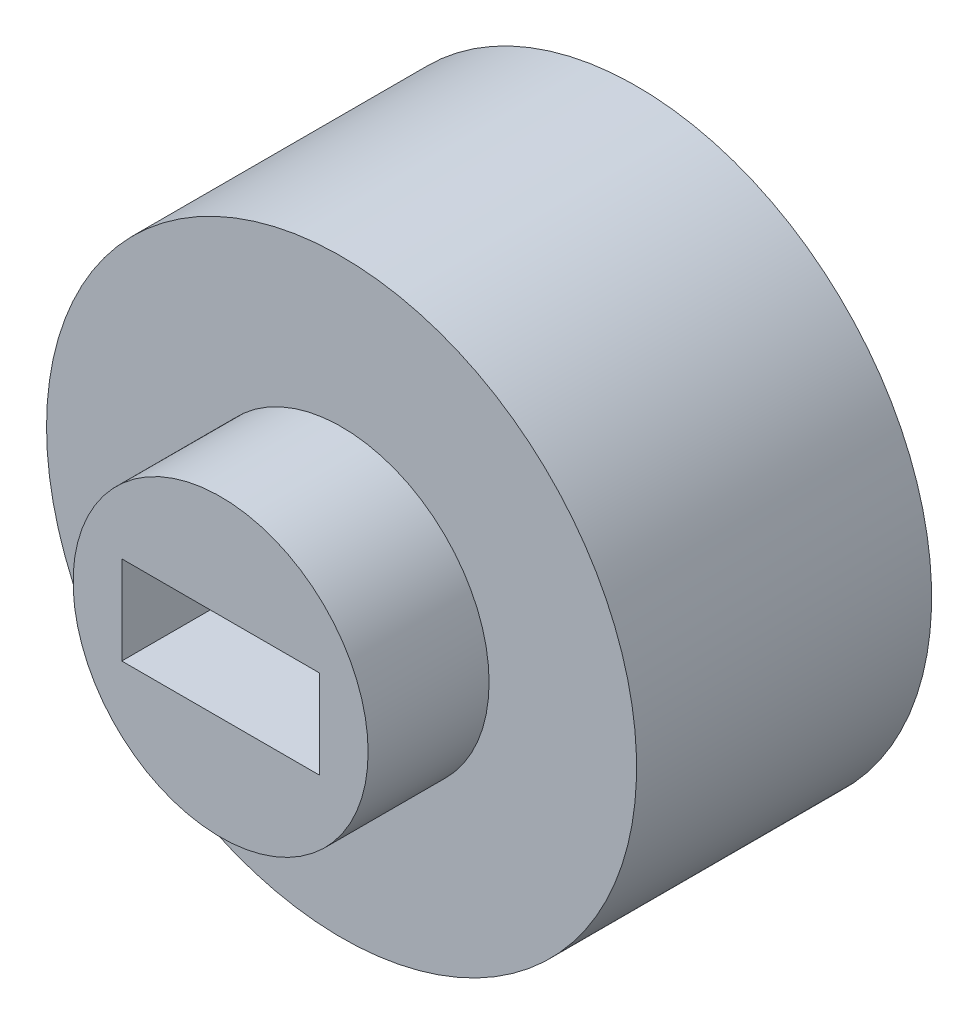
ISO-10303-21;
HEADER;
FILE_DESCRIPTION(('STEP AP214'),'2;1');
FILE_NAME('part.step','',(''),(''),'','','');
FILE_SCHEMA(('AUTOMOTIVE_DESIGN { 1 0 10303 214 1 1 1 1 }'));
ENDSEC;
DATA;
#1=APPLICATION_CONTEXT('core data for automotive mechanical design processes');
#2=APPLICATION_PROTOCOL_DEFINITION('international standard','automotive_design',2000,#1);
#3=PRODUCT_CONTEXT('',#1,'mechanical');
#4=PRODUCT('Part','Part','',(#3));
#5=PRODUCT_RELATED_PRODUCT_CATEGORY('part','',(#4));
#6=PRODUCT_DEFINITION_FORMATION('','',#4);
#7=PRODUCT_DEFINITION_CONTEXT('part definition',#1,'design');
#8=PRODUCT_DEFINITION('design','',#6,#7);
#9=PRODUCT_DEFINITION_SHAPE('','',#8);
#10=(LENGTH_UNIT() NAMED_UNIT(*) SI_UNIT(.MILLI.,.METRE.));
#11=(NAMED_UNIT(*) PLANE_ANGLE_UNIT() SI_UNIT($,.RADIAN.));
#12=(NAMED_UNIT(*) SI_UNIT($,.STERADIAN.) SOLID_ANGLE_UNIT());
#13=UNCERTAINTY_MEASURE_WITH_UNIT(LENGTH_MEASURE(1.E-05),#10,'distance_accuracy_value','');
#14=(GEOMETRIC_REPRESENTATION_CONTEXT(3) GLOBAL_UNCERTAINTY_ASSIGNED_CONTEXT((#13)) GLOBAL_UNIT_ASSIGNED_CONTEXT((#10,
#11,#12)) REPRESENTATION_CONTEXT('',''));
#15=CARTESIAN_POINT('',(0.,0.,0.));
#16=DIRECTION('',(0.,0.,1.));
#17=DIRECTION('',(1.,0.,0.));
#18=AXIS2_PLACEMENT_3D('',#15,#16,#17);
#19=CARTESIAN_POINT('',(0.,0.,41.));
#20=DIRECTION('',(0.,0.,-1.));
#21=DIRECTION('',(-1.,0.,0.));
#22=AXIS2_PLACEMENT_3D('',#19,#20,#21);
#23=CYLINDRICAL_SURFACE('',#22,50.);
#24=CARTESIAN_POINT('',(0.,0.,41.));
#25=DIRECTION('',(0.,0.,1.));
#26=DIRECTION('',(1.,0.,0.));
#27=AXIS2_PLACEMENT_3D('',#24,#25,#26);
#28=CIRCLE('',#27,50.);
#29=CARTESIAN_POINT('',(50.,0.,41.));
#30=VERTEX_POINT('',#29);
#31=EDGE_CURVE('E11',#30,#30,#28,.T.);
#32=ORIENTED_EDGE('',*,*,#31,.F.);
#33=EDGE_LOOP('',(#32));
#34=FACE_BOUND('',#33,.T.);
#35=CARTESIAN_POINT('',(0.,0.,0.));
#36=DIRECTION('',(0.,0.,1.));
#37=DIRECTION('',(1.,0.,0.));
#38=AXIS2_PLACEMENT_3D('',#35,#36,#37);
#39=CIRCLE('',#38,50.);
#40=CARTESIAN_POINT('',(50.,0.,0.));
#41=VERTEX_POINT('',#40);
#42=EDGE_CURVE('E42',#41,#41,#39,.T.);
#43=ORIENTED_EDGE('',*,*,#42,.T.);
#44=EDGE_LOOP('',(#43));
#45=FACE_BOUND('',#44,.T.);
#46=ADVANCED_FACE('F39',(#34,#45),#23,.T.);
#47=CARTESIAN_POINT('',(0.,0.,41.));
#48=DIRECTION('',(0.,0.,1.));
#49=DIRECTION('',(1.,0.,0.));
#50=AXIS2_PLACEMENT_3D('',#47,#48,#49);
#51=PLANE('',#50);
#52=DIRECTION('',(0.,1.,0.));
#53=VECTOR('',#52,1.);
#54=CARTESIAN_POINT('',(33.5,15.,41.));
#55=LINE('',#54,#53);
#56=CARTESIAN_POINT('',(33.5,-15.,41.));
#57=VERTEX_POINT('',#56);
#58=CARTESIAN_POINT('',(33.5,15.,41.));
#59=VERTEX_POINT('',#58);
#60=EDGE_CURVE('E54',#57,#59,#55,.T.);
#61=ORIENTED_EDGE('',*,*,#60,.F.);
#62=DIRECTION('',(1.,0.,0.));
#63=VECTOR('',#62,1.);
#64=CARTESIAN_POINT('',(-33.5,-15.,41.));
#65=LINE('',#64,#63);
#66=CARTESIAN_POINT('',(-33.5,-15.,41.));
#67=VERTEX_POINT('',#66);
#68=EDGE_CURVE('E110',#67,#57,#65,.T.);
#69=ORIENTED_EDGE('',*,*,#68,.F.);
#70=DIRECTION('',(0.,-1.,0.));
#71=VECTOR('',#70,1.);
#72=CARTESIAN_POINT('',(-33.5,15.,41.));
#73=LINE('',#72,#71);
#74=CARTESIAN_POINT('',(-33.5,15.,41.));
#75=VERTEX_POINT('',#74);
#76=EDGE_CURVE('E92',#75,#67,#73,.T.);
#77=ORIENTED_EDGE('',*,*,#76,.F.);
#78=DIRECTION('',(-1.,0.,0.));
#79=VECTOR('',#78,1.);
#80=CARTESIAN_POINT('',(-33.5,15.,41.));
#81=LINE('',#80,#79);
#82=EDGE_CURVE('E106',#59,#75,#81,.T.);
#83=ORIENTED_EDGE('',*,*,#82,.F.);
#84=EDGE_LOOP('',(#61,#69,#77,#83));
#85=FACE_BOUND('',#84,.T.);
#86=ORIENTED_EDGE('',*,*,#31,.T.);
#87=EDGE_LOOP('',(#86));
#88=FACE_BOUND('',#87,.T.);
#89=ADVANCED_FACE('F118',(#85,#88),#51,.T.);
#90=CARTESIAN_POINT('',(33.5,15.,0.));
#91=DIRECTION('',(1.,0.,0.));
#92=DIRECTION('',(0.,0.,-1.));
#93=AXIS2_PLACEMENT_3D('',#90,#91,#92);
#94=PLANE('',#93);
#95=ORIENTED_EDGE('',*,*,#60,.T.);
#96=DIRECTION('',(0.,0.,1.));
#97=VECTOR('',#96,1.);
#98=CARTESIAN_POINT('',(33.5,15.,0.));
#99=LINE('',#98,#97);
#100=CARTESIAN_POINT('',(33.5,15.,0.));
#101=VERTEX_POINT('',#100);
#102=EDGE_CURVE('E88',#101,#59,#99,.T.);
#103=ORIENTED_EDGE('',*,*,#102,.F.);
#104=DIRECTION('',(0.,1.,0.));
#105=VECTOR('',#104,1.);
#106=CARTESIAN_POINT('',(33.5,15.,0.));
#107=LINE('',#106,#105);
#108=CARTESIAN_POINT('',(33.5,-15.,0.));
#109=VERTEX_POINT('',#108);
#110=EDGE_CURVE('E101',#109,#101,#107,.T.);
#111=ORIENTED_EDGE('',*,*,#110,.F.);
#112=DIRECTION('',(0.,0.,1.));
#113=VECTOR('',#112,1.);
#114=CARTESIAN_POINT('',(33.5,-15.,0.));
#115=LINE('',#114,#113);
#116=EDGE_CURVE('E47',#109,#57,#115,.T.);
#117=ORIENTED_EDGE('',*,*,#116,.T.);
#118=EDGE_LOOP('',(#95,#103,#111,#117));
#119=FACE_BOUND('',#118,.T.);
#120=ADVANCED_FACE('F121',(#119),#94,.F.);
#121=CARTESIAN_POINT('',(-33.5,-15.,0.));
#122=DIRECTION('',(0.,-1.,0.));
#123=DIRECTION('',(0.,0.,-1.));
#124=AXIS2_PLACEMENT_3D('',#121,#122,#123);
#125=PLANE('',#124);
#126=ORIENTED_EDGE('',*,*,#68,.T.);
#127=ORIENTED_EDGE('',*,*,#116,.F.);
#128=DIRECTION('',(1.,0.,0.));
#129=VECTOR('',#128,1.);
#130=CARTESIAN_POINT('',(-33.5,-15.,0.));
#131=LINE('',#130,#129);
#132=CARTESIAN_POINT('',(-33.5,-15.,0.));
#133=VERTEX_POINT('',#132);
#134=EDGE_CURVE('E80',#133,#109,#131,.T.);
#135=ORIENTED_EDGE('',*,*,#134,.F.);
#136=DIRECTION('',(0.,0.,1.));
#137=VECTOR('',#136,1.);
#138=CARTESIAN_POINT('',(-33.5,-15.,0.));
#139=LINE('',#138,#137);
#140=EDGE_CURVE('E83',#133,#67,#139,.T.);
#141=ORIENTED_EDGE('',*,*,#140,.T.);
#142=EDGE_LOOP('',(#126,#127,#135,#141));
#143=FACE_BOUND('',#142,.T.);
#144=ADVANCED_FACE('F82',(#143),#125,.F.);
#145=CARTESIAN_POINT('',(-33.5,15.,0.));
#146=DIRECTION('',(-1.,0.,0.));
#147=DIRECTION('',(0.,-1.,0.));
#148=AXIS2_PLACEMENT_3D('',#145,#146,#147);
#149=PLANE('',#148);
#150=ORIENTED_EDGE('',*,*,#76,.T.);
#151=ORIENTED_EDGE('',*,*,#140,.F.);
#152=DIRECTION('',(0.,-1.,0.));
#153=VECTOR('',#152,1.);
#154=CARTESIAN_POINT('',(-33.5,15.,0.));
#155=LINE('',#154,#153);
#156=CARTESIAN_POINT('',(-33.5,15.,0.));
#157=VERTEX_POINT('',#156);
#158=EDGE_CURVE('E62',#157,#133,#155,.T.);
#159=ORIENTED_EDGE('',*,*,#158,.F.);
#160=DIRECTION('',(0.,0.,1.));
#161=VECTOR('',#160,1.);
#162=CARTESIAN_POINT('',(-33.5,15.,0.));
#163=LINE('',#162,#161);
#164=EDGE_CURVE('E94',#157,#75,#163,.T.);
#165=ORIENTED_EDGE('',*,*,#164,.T.);
#166=EDGE_LOOP('',(#150,#151,#159,#165));
#167=FACE_BOUND('',#166,.T.);
#168=ADVANCED_FACE('F90',(#167),#149,.F.);
#169=CARTESIAN_POINT('',(-33.5,15.,0.));
#170=DIRECTION('',(0.,1.,0.));
#171=DIRECTION('',(0.,0.,1.));
#172=AXIS2_PLACEMENT_3D('',#169,#170,#171);
#173=PLANE('',#172);
#174=ORIENTED_EDGE('',*,*,#82,.T.);
#175=ORIENTED_EDGE('',*,*,#164,.F.);
#176=DIRECTION('',(-1.,0.,0.));
#177=VECTOR('',#176,1.);
#178=CARTESIAN_POINT('',(-33.5,15.,0.));
#179=LINE('',#178,#177);
#180=EDGE_CURVE('E99',#101,#157,#179,.T.);
#181=ORIENTED_EDGE('',*,*,#180,.F.);
#182=ORIENTED_EDGE('',*,*,#102,.T.);
#183=EDGE_LOOP('',(#174,#175,#181,#182));
#184=FACE_BOUND('',#183,.T.);
#185=ADVANCED_FACE('F116',(#184),#173,.F.);
#186=CARTESIAN_POINT('',(0.,0.,0.));
#187=DIRECTION('',(0.,0.,-1.));
#188=DIRECTION('',(-1.,0.,0.));
#189=AXIS2_PLACEMENT_3D('',#186,#187,#188);
#190=PLANE('',#189);
#191=ORIENTED_EDGE('',*,*,#42,.F.);
#192=EDGE_LOOP('',(#191));
#193=FACE_BOUND('',#192,.T.);
#194=CARTESIAN_POINT('',(0.,0.,0.));
#195=DIRECTION('',(0.,0.,-1.));
#196=DIRECTION('',(-1.,0.,0.));
#197=AXIS2_PLACEMENT_3D('',#194,#195,#196);
#198=CIRCLE('',#197,100.);
#199=CARTESIAN_POINT('',(-100.,0.,0.));
#200=VERTEX_POINT('',#199);
#201=EDGE_CURVE('E131',#200,#200,#198,.T.);
#202=ORIENTED_EDGE('',*,*,#201,.F.);
#203=EDGE_LOOP('',(#202));
#204=FACE_BOUND('',#203,.T.);
#205=ADVANCED_FACE('F147',(#193,#204),#190,.F.);
#206=CARTESIAN_POINT('',(0.,0.,-100.));
#207=DIRECTION('',(0.,0.,-1.));
#208=DIRECTION('',(-1.,0.,0.));
#209=AXIS2_PLACEMENT_3D('',#206,#207,#208);
#210=PLANE('',#209);
#211=CARTESIAN_POINT('',(0.,0.,-100.));
#212=DIRECTION('',(0.,0.,-1.));
#213=DIRECTION('',(-1.,0.,0.));
#214=AXIS2_PLACEMENT_3D('',#211,#212,#213);
#215=CIRCLE('',#214,100.);
#216=CARTESIAN_POINT('',(-100.,0.,-100.));
#217=VERTEX_POINT('',#216);
#218=EDGE_CURVE('E129',#217,#217,#215,.T.);
#219=ORIENTED_EDGE('',*,*,#218,.T.);
#220=EDGE_LOOP('',(#219));
#221=FACE_BOUND('',#220,.T.);
#222=ADVANCED_FACE('F153',(#221),#210,.T.);
#223=CARTESIAN_POINT('',(0.,0.,-100.));
#224=DIRECTION('',(0.,0.,1.));
#225=DIRECTION('',(1.,0.,0.));
#226=AXIS2_PLACEMENT_3D('',#223,#224,#225);
#227=CYLINDRICAL_SURFACE('',#226,100.);
#228=ORIENTED_EDGE('',*,*,#218,.F.);
#229=EDGE_LOOP('',(#228));
#230=FACE_BOUND('',#229,.T.);
#231=ORIENTED_EDGE('',*,*,#201,.T.);
#232=EDGE_LOOP('',(#231));
#233=FACE_BOUND('',#232,.T.);
#234=ADVANCED_FACE('F150',(#230,#233),#227,.T.);
#235=ORIENTED_EDGE('',*,*,#158,.T.);
#236=ORIENTED_EDGE('',*,*,#134,.T.);
#237=ORIENTED_EDGE('',*,*,#110,.T.);
#238=ORIENTED_EDGE('',*,*,#180,.T.);
#239=EDGE_LOOP('',(#235,#236,#237,#238));
#240=FACE_BOUND('',#239,.T.);
#241=ADVANCED_FACE('F97',(#240),#190,.F.);
#242=CLOSED_SHELL('',(#46,#89,#120,#144,#168,#185,#205,#222,#234,#241));
#243=MANIFOLD_SOLID_BREP('B2',#242);
#244=ADVANCED_BREP_SHAPE_REPRESENTATION('',(#18,#243),#14);
#245=SHAPE_DEFINITION_REPRESENTATION(#9,#244);
ENDSEC;
END-ISO-10303-21;
